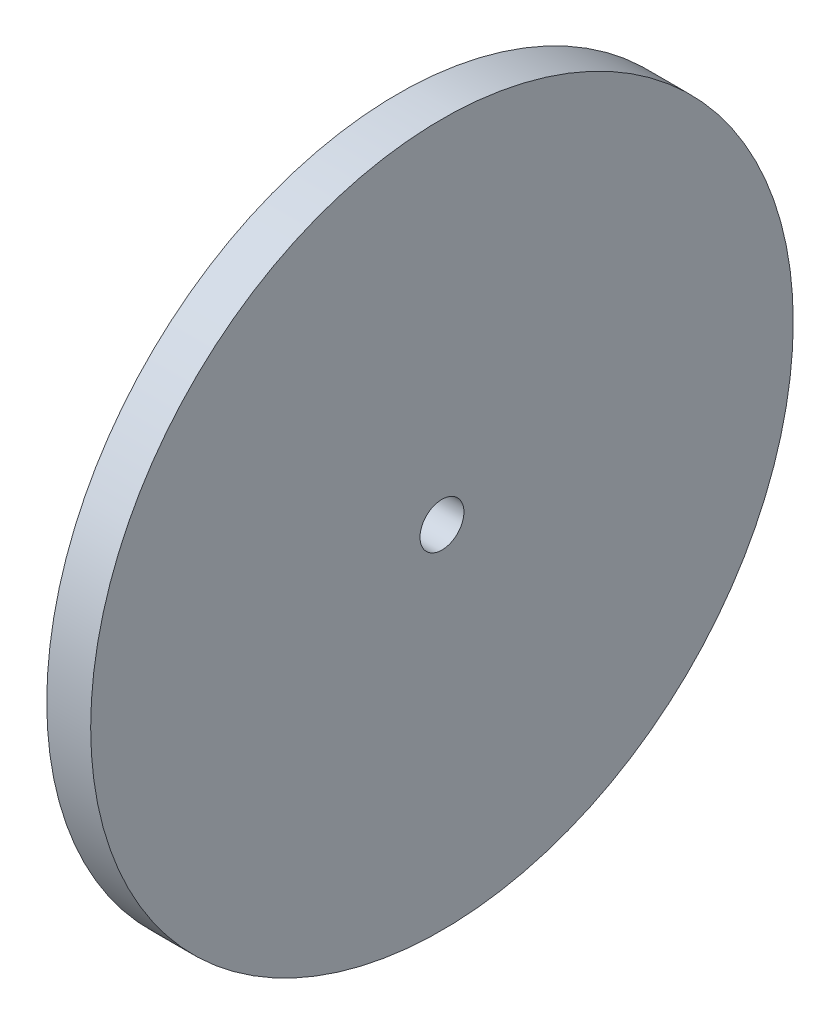
ISO-10303-21;
HEADER;
FILE_DESCRIPTION(('STEP AP214'),'2;1');
FILE_NAME('part.step','',(''),(''),'','','');
FILE_SCHEMA(('AUTOMOTIVE_DESIGN { 1 0 10303 214 1 1 1 1 }'));
ENDSEC;
DATA;
#1=APPLICATION_CONTEXT('core data for automotive mechanical design processes');
#2=APPLICATION_PROTOCOL_DEFINITION('international standard','automotive_design',2000,#1);
#3=PRODUCT_CONTEXT('',#1,'mechanical');
#4=PRODUCT('Part','Part','',(#3));
#5=PRODUCT_RELATED_PRODUCT_CATEGORY('part','',(#4));
#6=PRODUCT_DEFINITION_FORMATION('','',#4);
#7=PRODUCT_DEFINITION_CONTEXT('part definition',#1,'design');
#8=PRODUCT_DEFINITION('design','',#6,#7);
#9=PRODUCT_DEFINITION_SHAPE('','',#8);
#10=(LENGTH_UNIT() NAMED_UNIT(*) SI_UNIT(.MILLI.,.METRE.));
#11=(NAMED_UNIT(*) PLANE_ANGLE_UNIT() SI_UNIT($,.RADIAN.));
#12=(NAMED_UNIT(*) SI_UNIT($,.STERADIAN.) SOLID_ANGLE_UNIT());
#13=UNCERTAINTY_MEASURE_WITH_UNIT(LENGTH_MEASURE(1.E-05),#10,'distance_accuracy_value','');
#14=(GEOMETRIC_REPRESENTATION_CONTEXT(3) GLOBAL_UNCERTAINTY_ASSIGNED_CONTEXT((#13)) GLOBAL_UNIT_ASSIGNED_CONTEXT((#10,
#11,#12)) REPRESENTATION_CONTEXT('',''));
#15=CARTESIAN_POINT('',(0.,0.,0.));
#16=DIRECTION('',(0.,0.,1.));
#17=DIRECTION('',(1.,0.,0.));
#18=AXIS2_PLACEMENT_3D('',#15,#16,#17);
#19=CARTESIAN_POINT('',(5.,0.,0.));
#20=DIRECTION('',(-1.,0.,0.));
#21=DIRECTION('',(0.,0.,1.));
#22=AXIS2_PLACEMENT_3D('',#19,#20,#21);
#23=CYLINDRICAL_SURFACE('',#22,40.);
#24=CARTESIAN_POINT('',(5.,0.,0.));
#25=DIRECTION('',(1.,0.,0.));
#26=DIRECTION('',(0.,0.,-1.));
#27=AXIS2_PLACEMENT_3D('',#24,#25,#26);
#28=CIRCLE('',#27,40.);
#29=CARTESIAN_POINT('',(5.,0.,-40.));
#30=VERTEX_POINT('',#29);
#31=EDGE_CURVE('E10',#30,#30,#28,.T.);
#32=ORIENTED_EDGE('',*,*,#31,.F.);
#33=EDGE_LOOP('',(#32));
#34=FACE_BOUND('',#33,.T.);
#35=CARTESIAN_POINT('',(0.,0.,0.));
#36=DIRECTION('',(1.,0.,0.));
#37=DIRECTION('',(0.,0.,-1.));
#38=AXIS2_PLACEMENT_3D('',#35,#36,#37);
#39=CIRCLE('',#38,40.);
#40=CARTESIAN_POINT('',(0.,0.,-40.));
#41=VERTEX_POINT('',#40);
#42=EDGE_CURVE('E34',#41,#41,#39,.T.);
#43=ORIENTED_EDGE('',*,*,#42,.T.);
#44=EDGE_LOOP('',(#43));
#45=FACE_BOUND('',#44,.T.);
#46=ADVANCED_FACE('F31',(#34,#45),#23,.T.);
#47=CARTESIAN_POINT('',(5.,0.,0.));
#48=DIRECTION('',(1.,0.,0.));
#49=DIRECTION('',(0.,0.,-1.));
#50=AXIS2_PLACEMENT_3D('',#47,#48,#49);
#51=PLANE('',#50);
#52=CARTESIAN_POINT('',(5.,0.,0.));
#53=DIRECTION('',(1.,0.,0.));
#54=DIRECTION('',(0.,0.,-1.));
#55=AXIS2_PLACEMENT_3D('',#52,#53,#54);
#56=CIRCLE('',#55,2.5);
#57=CARTESIAN_POINT('',(5.,0.,-2.5));
#58=VERTEX_POINT('',#57);
#59=EDGE_CURVE('E43',#58,#58,#56,.T.);
#60=ORIENTED_EDGE('',*,*,#59,.F.);
#61=EDGE_LOOP('',(#60));
#62=FACE_BOUND('',#61,.T.);
#63=ORIENTED_EDGE('',*,*,#31,.T.);
#64=EDGE_LOOP('',(#63));
#65=FACE_BOUND('',#64,.T.);
#66=ADVANCED_FACE('F58',(#62,#65),#51,.T.);
#67=CARTESIAN_POINT('',(0.,0.,0.));
#68=DIRECTION('',(1.,0.,0.));
#69=DIRECTION('',(0.,0.,-1.));
#70=AXIS2_PLACEMENT_3D('',#67,#68,#69);
#71=PLANE('',#70);
#72=CARTESIAN_POINT('',(0.,0.,0.));
#73=DIRECTION('',(1.,0.,0.));
#74=DIRECTION('',(0.,0.,-1.));
#75=AXIS2_PLACEMENT_3D('',#72,#73,#74);
#76=CIRCLE('',#75,2.5);
#77=CARTESIAN_POINT('',(0.,0.,-2.5));
#78=VERTEX_POINT('',#77);
#79=EDGE_CURVE('E41',#78,#78,#76,.T.);
#80=ORIENTED_EDGE('',*,*,#79,.T.);
#81=EDGE_LOOP('',(#80));
#82=FACE_BOUND('',#81,.T.);
#83=ORIENTED_EDGE('',*,*,#42,.F.);
#84=EDGE_LOOP('',(#83));
#85=FACE_BOUND('',#84,.T.);
#86=ADVANCED_FACE('F49',(#82,#85),#71,.F.);
#87=CARTESIAN_POINT('',(0.,0.,0.));
#88=DIRECTION('',(1.,0.,0.));
#89=DIRECTION('',(0.,0.,-1.));
#90=AXIS2_PLACEMENT_3D('',#87,#88,#89);
#91=CYLINDRICAL_SURFACE('',#90,2.5);
#92=ORIENTED_EDGE('',*,*,#79,.F.);
#93=EDGE_LOOP('',(#92));
#94=FACE_BOUND('',#93,.T.);
#95=ORIENTED_EDGE('',*,*,#59,.T.);
#96=EDGE_LOOP('',(#95));
#97=FACE_BOUND('',#96,.T.);
#98=ADVANCED_FACE('F52',(#94,#97),#91,.F.);
#99=CLOSED_SHELL('',(#46,#66,#86,#98));
#100=MANIFOLD_SOLID_BREP('B2',#99);
#101=ADVANCED_BREP_SHAPE_REPRESENTATION('',(#18,#100),#14);
#102=SHAPE_DEFINITION_REPRESENTATION(#9,#101);
ENDSEC;
END-ISO-10303-21;
